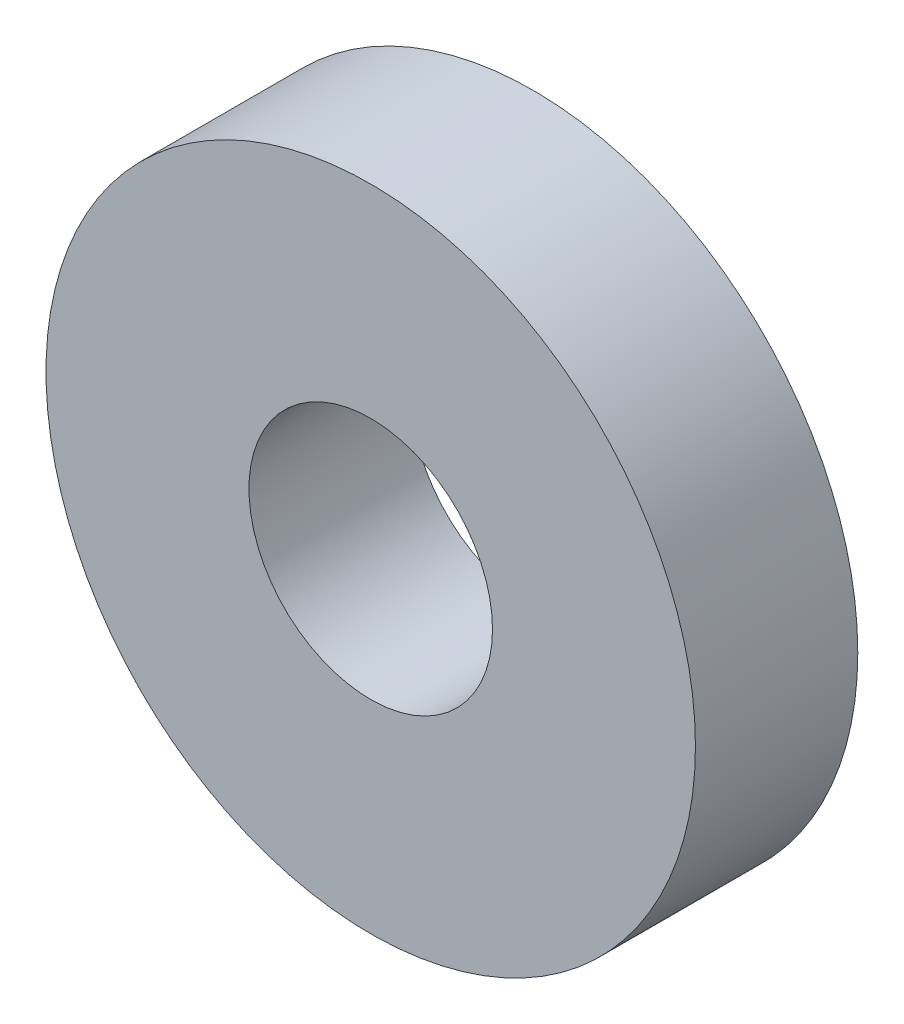
ISO-10303-21;
HEADER;
FILE_DESCRIPTION(('STEP AP214'),'2;1');
FILE_NAME('part.step','',(''),(''),'','','');
FILE_SCHEMA(('AUTOMOTIVE_DESIGN { 1 0 10303 214 1 1 1 1 }'));
ENDSEC;
DATA;
#1=APPLICATION_CONTEXT('core data for automotive mechanical design processes');
#2=APPLICATION_PROTOCOL_DEFINITION('international standard','automotive_design',2000,#1);
#3=PRODUCT_CONTEXT('',#1,'mechanical');
#4=PRODUCT('Part','Part','',(#3));
#5=PRODUCT_RELATED_PRODUCT_CATEGORY('part','',(#4));
#6=PRODUCT_DEFINITION_FORMATION('','',#4);
#7=PRODUCT_DEFINITION_CONTEXT('part definition',#1,'design');
#8=PRODUCT_DEFINITION('design','',#6,#7);
#9=PRODUCT_DEFINITION_SHAPE('','',#8);
#10=(LENGTH_UNIT() NAMED_UNIT(*) SI_UNIT(.MILLI.,.METRE.));
#11=(NAMED_UNIT(*) PLANE_ANGLE_UNIT() SI_UNIT($,.RADIAN.));
#12=(NAMED_UNIT(*) SI_UNIT($,.STERADIAN.) SOLID_ANGLE_UNIT());
#13=UNCERTAINTY_MEASURE_WITH_UNIT(LENGTH_MEASURE(1.E-05),#10,'distance_accuracy_value','');
#14=(GEOMETRIC_REPRESENTATION_CONTEXT(3) GLOBAL_UNCERTAINTY_ASSIGNED_CONTEXT((#13)) GLOBAL_UNIT_ASSIGNED_CONTEXT((#10,
#11,#12)) REPRESENTATION_CONTEXT('',''));
#15=CARTESIAN_POINT('',(0.,0.,0.));
#16=DIRECTION('',(0.,0.,1.));
#17=DIRECTION('',(1.,0.,0.));
#18=AXIS2_PLACEMENT_3D('',#15,#16,#17);
#19=CARTESIAN_POINT('',(0.,0.,20.));
#20=DIRECTION('',(0.,0.,1.));
#21=DIRECTION('',(1.,0.,0.));
#22=AXIS2_PLACEMENT_3D('',#19,#20,#21);
#23=PLANE('',#22);
#24=CARTESIAN_POINT('',(0.,0.,20.));
#25=DIRECTION('',(0.,0.,1.));
#26=DIRECTION('',(1.,0.,0.));
#27=AXIS2_PLACEMENT_3D('',#24,#25,#26);
#28=CIRCLE('',#27,40.);
#29=CARTESIAN_POINT('',(40.,0.,20.));
#30=VERTEX_POINT('',#29);
#31=EDGE_CURVE('E10',#30,#30,#28,.T.);
#32=ORIENTED_EDGE('',*,*,#31,.T.);
#33=EDGE_LOOP('',(#32));
#34=FACE_BOUND('',#33,.T.);
#35=CARTESIAN_POINT('',(0.,0.,20.));
#36=DIRECTION('',(0.,0.,1.));
#37=DIRECTION('',(1.,0.,0.));
#38=AXIS2_PLACEMENT_3D('',#35,#36,#37);
#39=CIRCLE('',#38,15.);
#40=CARTESIAN_POINT('',(15.,0.,20.));
#41=VERTEX_POINT('',#40);
#42=EDGE_CURVE('E48',#41,#41,#39,.T.);
#43=ORIENTED_EDGE('',*,*,#42,.F.);
#44=EDGE_LOOP('',(#43));
#45=FACE_BOUND('',#44,.T.);
#46=ADVANCED_FACE('F37',(#34,#45),#23,.T.);
#47=CARTESIAN_POINT('',(0.,0.,0.));
#48=DIRECTION('',(0.,0.,1.));
#49=DIRECTION('',(1.,0.,0.));
#50=AXIS2_PLACEMENT_3D('',#47,#48,#49);
#51=PLANE('',#50);
#52=CARTESIAN_POINT('',(0.,0.,0.));
#53=DIRECTION('',(0.,0.,1.));
#54=DIRECTION('',(1.,0.,0.));
#55=AXIS2_PLACEMENT_3D('',#52,#53,#54);
#56=CIRCLE('',#55,40.);
#57=CARTESIAN_POINT('',(40.,0.,0.));
#58=VERTEX_POINT('',#57);
#59=EDGE_CURVE('E41',#58,#58,#56,.T.);
#60=ORIENTED_EDGE('',*,*,#59,.F.);
#61=EDGE_LOOP('',(#60));
#62=FACE_BOUND('',#61,.T.);
#63=CARTESIAN_POINT('',(0.,0.,0.));
#64=DIRECTION('',(0.,0.,1.));
#65=DIRECTION('',(1.,0.,0.));
#66=AXIS2_PLACEMENT_3D('',#63,#64,#65);
#67=CIRCLE('',#66,15.);
#68=CARTESIAN_POINT('',(15.,0.,0.));
#69=VERTEX_POINT('',#68);
#70=EDGE_CURVE('E50',#69,#69,#67,.T.);
#71=ORIENTED_EDGE('',*,*,#70,.T.);
#72=EDGE_LOOP('',(#71));
#73=FACE_BOUND('',#72,.T.);
#74=ADVANCED_FACE('F60',(#62,#73),#51,.F.);
#75=CARTESIAN_POINT('',(0.,0.,20.));
#76=DIRECTION('',(0.,0.,-1.));
#77=DIRECTION('',(-1.,0.,0.));
#78=AXIS2_PLACEMENT_3D('',#75,#76,#77);
#79=CYLINDRICAL_SURFACE('',#78,40.);
#80=ORIENTED_EDGE('',*,*,#31,.F.);
#81=EDGE_LOOP('',(#80));
#82=FACE_BOUND('',#81,.T.);
#83=ORIENTED_EDGE('',*,*,#59,.T.);
#84=EDGE_LOOP('',(#83));
#85=FACE_BOUND('',#84,.T.);
#86=ADVANCED_FACE('F39',(#82,#85),#79,.T.);
#87=CARTESIAN_POINT('',(0.,0.,20.));
#88=DIRECTION('',(0.,0.,-1.));
#89=DIRECTION('',(-1.,0.,0.));
#90=AXIS2_PLACEMENT_3D('',#87,#88,#89);
#91=CYLINDRICAL_SURFACE('',#90,15.);
#92=ORIENTED_EDGE('',*,*,#42,.T.);
#93=EDGE_LOOP('',(#92));
#94=FACE_BOUND('',#93,.T.);
#95=ORIENTED_EDGE('',*,*,#70,.F.);
#96=EDGE_LOOP('',(#95));
#97=FACE_BOUND('',#96,.T.);
#98=ADVANCED_FACE('F56',(#94,#97),#91,.F.);
#99=CLOSED_SHELL('',(#46,#74,#86,#98));
#100=MANIFOLD_SOLID_BREP('B2',#99);
#101=ADVANCED_BREP_SHAPE_REPRESENTATION('',(#18,#100),#14);
#102=SHAPE_DEFINITION_REPRESENTATION(#9,#101);
ENDSEC;
END-ISO-10303-21;
